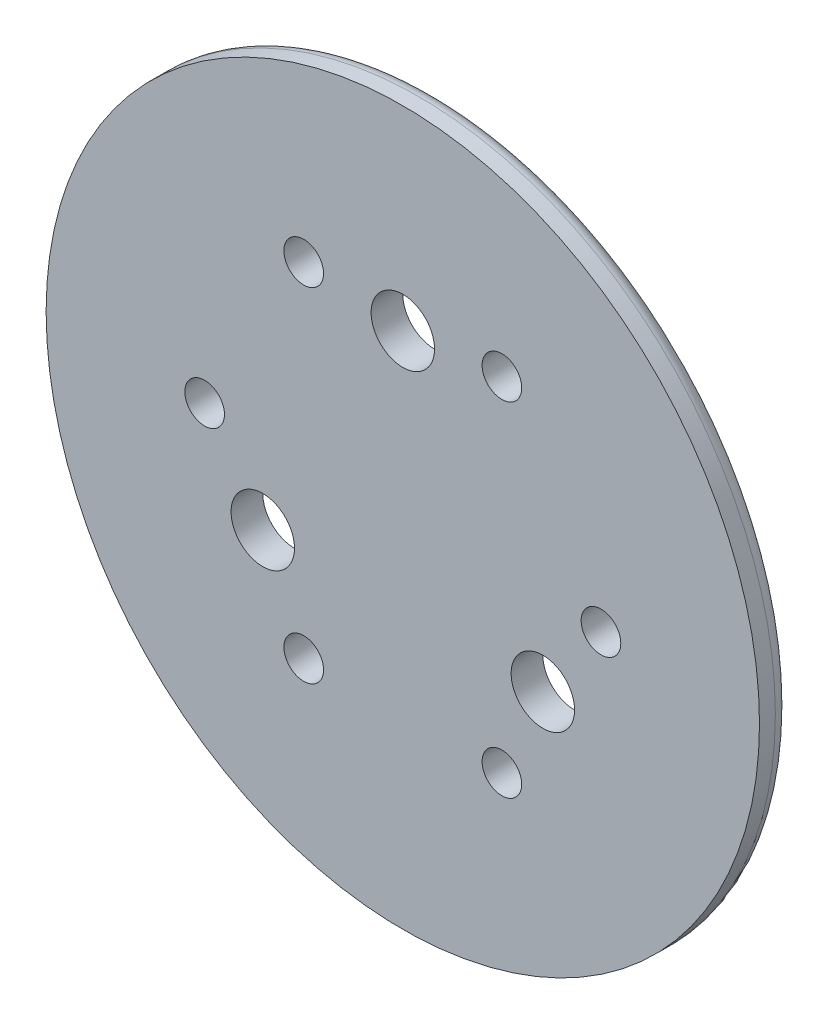
ISO-10303-21;
HEADER;
FILE_DESCRIPTION(('STEP AP214'),'2;1');
FILE_NAME('part.step','',(''),(''),'','','');
FILE_SCHEMA(('AUTOMOTIVE_DESIGN { 1 0 10303 214 1 1 1 1 }'));
ENDSEC;
DATA;
#1=APPLICATION_CONTEXT('core data for automotive mechanical design processes');
#2=APPLICATION_PROTOCOL_DEFINITION('international standard','automotive_design',2000,#1);
#3=PRODUCT_CONTEXT('',#1,'mechanical');
#4=PRODUCT('Part','Part','',(#3));
#5=PRODUCT_RELATED_PRODUCT_CATEGORY('part','',(#4));
#6=PRODUCT_DEFINITION_FORMATION('','',#4);
#7=PRODUCT_DEFINITION_CONTEXT('part definition',#1,'design');
#8=PRODUCT_DEFINITION('design','',#6,#7);
#9=PRODUCT_DEFINITION_SHAPE('','',#8);
#10=(LENGTH_UNIT() NAMED_UNIT(*) SI_UNIT(.MILLI.,.METRE.));
#11=(NAMED_UNIT(*) PLANE_ANGLE_UNIT() SI_UNIT($,.RADIAN.));
#12=(NAMED_UNIT(*) SI_UNIT($,.STERADIAN.) SOLID_ANGLE_UNIT());
#13=UNCERTAINTY_MEASURE_WITH_UNIT(LENGTH_MEASURE(1.E-05),#10,'distance_accuracy_value','');
#14=(GEOMETRIC_REPRESENTATION_CONTEXT(3) GLOBAL_UNCERTAINTY_ASSIGNED_CONTEXT((#13)) GLOBAL_UNIT_ASSIGNED_CONTEXT((#10,
#11,#12)) REPRESENTATION_CONTEXT('',''));
#15=CARTESIAN_POINT('',(0.,0.,0.));
#16=DIRECTION('',(0.,0.,1.));
#17=DIRECTION('',(1.,0.,0.));
#18=AXIS2_PLACEMENT_3D('',#15,#16,#17);
#19=CARTESIAN_POINT('',(0.,0.,2.));
#20=DIRECTION('',(0.,0.,1.));
#21=DIRECTION('',(1.,0.,0.));
#22=AXIS2_PLACEMENT_3D('',#19,#20,#21);
#23=PLANE('',#22);
#24=CARTESIAN_POINT('',(-8.83345911860132,-5.09999999999992,2.));
#25=DIRECTION('',(0.,0.,1.));
#26=DIRECTION('',(1.,0.,0.));
#27=AXIS2_PLACEMENT_3D('',#24,#25,#26);
#28=CIRCLE('',#27,2.);
#29=CARTESIAN_POINT('',(-6.83345911860132,-5.09999999999992,2.));
#30=VERTEX_POINT('',#29);
#31=EDGE_CURVE('E94',#30,#30,#28,.T.);
#32=ORIENTED_EDGE('',*,*,#31,.F.);
#33=EDGE_LOOP('',(#32));
#34=FACE_BOUND('',#33,.T.);
#35=CARTESIAN_POINT('',(-6.2500000000001,-10.8253175473054,2.));
#36=DIRECTION('',(0.,0.,1.));
#37=DIRECTION('',(1.,0.,0.));
#38=AXIS2_PLACEMENT_3D('',#35,#36,#37);
#39=CIRCLE('',#38,1.25);
#40=CARTESIAN_POINT('',(-5.0000000000001,-10.8253175473054,2.));
#41=VERTEX_POINT('',#40);
#42=EDGE_CURVE('E82',#41,#41,#39,.T.);
#43=ORIENTED_EDGE('',*,*,#42,.F.);
#44=EDGE_LOOP('',(#43));
#45=FACE_BOUND('',#44,.T.);
#46=CARTESIAN_POINT('',(12.5,0.,2.));
#47=DIRECTION('',(0.,0.,1.));
#48=DIRECTION('',(1.,0.,0.));
#49=AXIS2_PLACEMENT_3D('',#46,#47,#48);
#50=CIRCLE('',#49,1.25);
#51=CARTESIAN_POINT('',(13.75,0.,2.));
#52=VERTEX_POINT('',#51);
#53=EDGE_CURVE('E70',#52,#52,#50,.T.);
#54=ORIENTED_EDGE('',*,*,#53,.F.);
#55=EDGE_LOOP('',(#54));
#56=FACE_BOUND('',#55,.T.);
#57=CARTESIAN_POINT('',(-6.25000000000002,10.8253175473055,2.));
#58=DIRECTION('',(0.,0.,1.));
#59=DIRECTION('',(1.,0.,0.));
#60=AXIS2_PLACEMENT_3D('',#57,#58,#59);
#61=CIRCLE('',#60,1.25);
#62=CARTESIAN_POINT('',(-5.00000000000002,10.8253175473055,2.));
#63=VERTEX_POINT('',#62);
#64=EDGE_CURVE('E58',#63,#63,#61,.T.);
#65=ORIENTED_EDGE('',*,*,#64,.F.);
#66=EDGE_LOOP('',(#65));
#67=FACE_BOUND('',#66,.T.);
#68=CARTESIAN_POINT('',(0.,0.,2.));
#69=DIRECTION('',(0.,0.,1.));
#70=DIRECTION('',(1.,0.,0.));
#71=AXIS2_PLACEMENT_3D('',#68,#69,#70);
#72=CIRCLE('',#71,22.5);
#73=CARTESIAN_POINT('',(22.5,0.,2.));
#74=VERTEX_POINT('',#73);
#75=EDGE_CURVE('E48',#74,#74,#72,.T.);
#76=ORIENTED_EDGE('',*,*,#75,.T.);
#77=EDGE_LOOP('',(#76));
#78=FACE_BOUND('',#77,.T.);
#79=CARTESIAN_POINT('',(0.,10.2,2.));
#80=DIRECTION('',(0.,0.,1.));
#81=DIRECTION('',(1.,0.,0.));
#82=AXIS2_PLACEMENT_3D('',#79,#80,#81);
#83=CIRCLE('',#82,2.);
#84=CARTESIAN_POINT('',(2.,10.2,2.));
#85=VERTEX_POINT('',#84);
#86=EDGE_CURVE('E52',#85,#85,#83,.T.);
#87=ORIENTED_EDGE('',*,*,#86,.F.);
#88=EDGE_LOOP('',(#87));
#89=FACE_BOUND('',#88,.T.);
#90=CARTESIAN_POINT('',(6.25000000000002,10.8253175473055,2.));
#91=DIRECTION('',(0.,0.,1.));
#92=DIRECTION('',(1.,0.,0.));
#93=AXIS2_PLACEMENT_3D('',#90,#91,#92);
#94=CIRCLE('',#93,1.25);
#95=CARTESIAN_POINT('',(7.50000000000002,10.8253175473055,2.));
#96=VERTEX_POINT('',#95);
#97=EDGE_CURVE('E64',#96,#96,#94,.T.);
#98=ORIENTED_EDGE('',*,*,#97,.F.);
#99=EDGE_LOOP('',(#98));
#100=FACE_BOUND('',#99,.T.);
#101=CARTESIAN_POINT('',(6.24999999999993,-10.8253175473055,2.));
#102=DIRECTION('',(0.,0.,1.));
#103=DIRECTION('',(1.,0.,0.));
#104=AXIS2_PLACEMENT_3D('',#101,#102,#103);
#105=CIRCLE('',#104,1.25);
#106=CARTESIAN_POINT('',(7.49999999999993,-10.8253175473055,2.));
#107=VERTEX_POINT('',#106);
#108=EDGE_CURVE('E76',#107,#107,#105,.T.);
#109=ORIENTED_EDGE('',*,*,#108,.F.);
#110=EDGE_LOOP('',(#109));
#111=FACE_BOUND('',#110,.T.);
#112=CARTESIAN_POINT('',(-12.5,1.38083988687754E-13,2.));
#113=DIRECTION('',(0.,0.,1.));
#114=DIRECTION('',(1.,0.,0.));
#115=AXIS2_PLACEMENT_3D('',#112,#113,#114);
#116=CIRCLE('',#115,1.25);
#117=CARTESIAN_POINT('',(-11.25,1.38083988687754E-13,2.));
#118=VERTEX_POINT('',#117);
#119=EDGE_CURVE('E88',#118,#118,#116,.T.);
#120=ORIENTED_EDGE('',*,*,#119,.F.);
#121=EDGE_LOOP('',(#120));
#122=FACE_BOUND('',#121,.T.);
#123=CARTESIAN_POINT('',(8.83345911860125,-5.10000000000004,2.));
#124=DIRECTION('',(0.,0.,1.));
#125=DIRECTION('',(1.,0.,0.));
#126=AXIS2_PLACEMENT_3D('',#123,#124,#125);
#127=CIRCLE('',#126,2.);
#128=CARTESIAN_POINT('',(10.8334591186013,-5.10000000000004,2.));
#129=VERTEX_POINT('',#128);
#130=EDGE_CURVE('E100',#129,#129,#127,.T.);
#131=ORIENTED_EDGE('',*,*,#130,.F.);
#132=EDGE_LOOP('',(#131));
#133=FACE_BOUND('',#132,.T.);
#134=ADVANCED_FACE('F37',(#34,#45,#56,#67,#78,#89,#100,#111,#122,#133),#23,.T.);
#135=CARTESIAN_POINT('',(0.,0.,0.));
#136=DIRECTION('',(0.,0.,1.));
#137=DIRECTION('',(1.,0.,0.));
#138=AXIS2_PLACEMENT_3D('',#135,#136,#137);
#139=PLANE('',#138);
#140=CARTESIAN_POINT('',(0.,0.,0.));
#141=DIRECTION('',(0.,0.,1.));
#142=DIRECTION('',(1.,0.,0.));
#143=AXIS2_PLACEMENT_3D('',#140,#141,#142);
#144=CIRCLE('',#143,21.5);
#145=CARTESIAN_POINT('',(21.5,0.,0.));
#146=VERTEX_POINT('',#145);
#147=EDGE_CURVE('E10',#146,#146,#144,.F.);
#148=ORIENTED_EDGE('',*,*,#147,.T.);
#149=EDGE_LOOP('',(#148));
#150=FACE_BOUND('',#149,.T.);
#151=CARTESIAN_POINT('',(0.,10.2,0.));
#152=DIRECTION('',(0.,0.,1.));
#153=DIRECTION('',(1.,0.,0.));
#154=AXIS2_PLACEMENT_3D('',#151,#152,#153);
#155=CIRCLE('',#154,2.);
#156=CARTESIAN_POINT('',(2.,10.2,0.));
#157=VERTEX_POINT('',#156);
#158=EDGE_CURVE('E55',#157,#157,#155,.T.);
#159=ORIENTED_EDGE('',*,*,#158,.T.);
#160=EDGE_LOOP('',(#159));
#161=FACE_BOUND('',#160,.T.);
#162=CARTESIAN_POINT('',(-6.25000000000002,10.8253175473055,0.));
#163=DIRECTION('',(0.,0.,1.));
#164=DIRECTION('',(1.,0.,0.));
#165=AXIS2_PLACEMENT_3D('',#162,#163,#164);
#166=CIRCLE('',#165,1.25);
#167=CARTESIAN_POINT('',(-5.00000000000002,10.8253175473055,0.));
#168=VERTEX_POINT('',#167);
#169=EDGE_CURVE('E61',#168,#168,#166,.T.);
#170=ORIENTED_EDGE('',*,*,#169,.T.);
#171=EDGE_LOOP('',(#170));
#172=FACE_BOUND('',#171,.T.);
#173=CARTESIAN_POINT('',(6.25000000000002,10.8253175473055,0.));
#174=DIRECTION('',(0.,0.,1.));
#175=DIRECTION('',(1.,0.,0.));
#176=AXIS2_PLACEMENT_3D('',#173,#174,#175);
#177=CIRCLE('',#176,1.25);
#178=CARTESIAN_POINT('',(7.50000000000002,10.8253175473055,0.));
#179=VERTEX_POINT('',#178);
#180=EDGE_CURVE('E67',#179,#179,#177,.T.);
#181=ORIENTED_EDGE('',*,*,#180,.T.);
#182=EDGE_LOOP('',(#181));
#183=FACE_BOUND('',#182,.T.);
#184=CARTESIAN_POINT('',(12.5,0.,0.));
#185=DIRECTION('',(0.,0.,1.));
#186=DIRECTION('',(1.,0.,0.));
#187=AXIS2_PLACEMENT_3D('',#184,#185,#186);
#188=CIRCLE('',#187,1.25);
#189=CARTESIAN_POINT('',(13.75,0.,0.));
#190=VERTEX_POINT('',#189);
#191=EDGE_CURVE('E73',#190,#190,#188,.T.);
#192=ORIENTED_EDGE('',*,*,#191,.T.);
#193=EDGE_LOOP('',(#192));
#194=FACE_BOUND('',#193,.T.);
#195=CARTESIAN_POINT('',(6.24999999999993,-10.8253175473055,0.));
#196=DIRECTION('',(0.,0.,1.));
#197=DIRECTION('',(1.,0.,0.));
#198=AXIS2_PLACEMENT_3D('',#195,#196,#197);
#199=CIRCLE('',#198,1.25);
#200=CARTESIAN_POINT('',(7.49999999999993,-10.8253175473055,0.));
#201=VERTEX_POINT('',#200);
#202=EDGE_CURVE('E79',#201,#201,#199,.T.);
#203=ORIENTED_EDGE('',*,*,#202,.T.);
#204=EDGE_LOOP('',(#203));
#205=FACE_BOUND('',#204,.T.);
#206=CARTESIAN_POINT('',(-6.2500000000001,-10.8253175473054,0.));
#207=DIRECTION('',(0.,0.,1.));
#208=DIRECTION('',(1.,0.,0.));
#209=AXIS2_PLACEMENT_3D('',#206,#207,#208);
#210=CIRCLE('',#209,1.25);
#211=CARTESIAN_POINT('',(-5.0000000000001,-10.8253175473054,0.));
#212=VERTEX_POINT('',#211);
#213=EDGE_CURVE('E85',#212,#212,#210,.T.);
#214=ORIENTED_EDGE('',*,*,#213,.T.);
#215=EDGE_LOOP('',(#214));
#216=FACE_BOUND('',#215,.T.);
#217=CARTESIAN_POINT('',(-12.5,1.38083988687754E-13,0.));
#218=DIRECTION('',(0.,0.,1.));
#219=DIRECTION('',(1.,0.,0.));
#220=AXIS2_PLACEMENT_3D('',#217,#218,#219);
#221=CIRCLE('',#220,1.25);
#222=CARTESIAN_POINT('',(-11.25,1.38083988687754E-13,0.));
#223=VERTEX_POINT('',#222);
#224=EDGE_CURVE('E91',#223,#223,#221,.T.);
#225=ORIENTED_EDGE('',*,*,#224,.T.);
#226=EDGE_LOOP('',(#225));
#227=FACE_BOUND('',#226,.T.);
#228=CARTESIAN_POINT('',(-8.83345911860132,-5.09999999999992,0.));
#229=DIRECTION('',(0.,0.,1.));
#230=DIRECTION('',(1.,0.,0.));
#231=AXIS2_PLACEMENT_3D('',#228,#229,#230);
#232=CIRCLE('',#231,2.);
#233=CARTESIAN_POINT('',(-6.83345911860132,-5.09999999999992,0.));
#234=VERTEX_POINT('',#233);
#235=EDGE_CURVE('E97',#234,#234,#232,.T.);
#236=ORIENTED_EDGE('',*,*,#235,.T.);
#237=EDGE_LOOP('',(#236));
#238=FACE_BOUND('',#237,.T.);
#239=CARTESIAN_POINT('',(8.83345911860125,-5.10000000000004,0.));
#240=DIRECTION('',(0.,0.,1.));
#241=DIRECTION('',(1.,0.,0.));
#242=AXIS2_PLACEMENT_3D('',#239,#240,#241);
#243=CIRCLE('',#242,2.);
#244=CARTESIAN_POINT('',(10.8334591186013,-5.10000000000004,0.));
#245=VERTEX_POINT('',#244);
#246=EDGE_CURVE('E103',#245,#245,#243,.T.);
#247=ORIENTED_EDGE('',*,*,#246,.T.);
#248=EDGE_LOOP('',(#247));
#249=FACE_BOUND('',#248,.T.);
#250=ADVANCED_FACE('F113',(#150,#161,#172,#183,#194,#205,#216,#227,#238,#249),#139,.F.);
#251=CARTESIAN_POINT('',(0.,0.,2.));
#252=DIRECTION('',(0.,0.,-1.));
#253=DIRECTION('',(-1.,0.,0.));
#254=AXIS2_PLACEMENT_3D('',#251,#252,#253);
#255=CYLINDRICAL_SURFACE('',#254,22.5);
#256=CARTESIAN_POINT('',(0.,0.,1.));
#257=DIRECTION('',(0.,0.,1.));
#258=DIRECTION('',(1.,0.,0.));
#259=AXIS2_PLACEMENT_3D('',#256,#257,#258);
#260=CIRCLE('',#259,22.5);
#261=CARTESIAN_POINT('',(22.5,0.,1.));
#262=VERTEX_POINT('',#261);
#263=EDGE_CURVE('E44',#262,#262,#260,.T.);
#264=ORIENTED_EDGE('',*,*,#263,.T.);
#265=EDGE_LOOP('',(#264));
#266=FACE_BOUND('',#265,.T.);
#267=ORIENTED_EDGE('',*,*,#75,.F.);
#268=EDGE_LOOP('',(#267));
#269=FACE_BOUND('',#268,.T.);
#270=ADVANCED_FACE('F119',(#266,#269),#255,.T.);
#271=CARTESIAN_POINT('',(0.,10.2,2.));
#272=DIRECTION('',(0.,0.,-1.));
#273=DIRECTION('',(-1.,0.,0.));
#274=AXIS2_PLACEMENT_3D('',#271,#272,#273);
#275=CYLINDRICAL_SURFACE('',#274,2.);
#276=ORIENTED_EDGE('',*,*,#86,.T.);
#277=EDGE_LOOP('',(#276));
#278=FACE_BOUND('',#277,.T.);
#279=ORIENTED_EDGE('',*,*,#158,.F.);
#280=EDGE_LOOP('',(#279));
#281=FACE_BOUND('',#280,.T.);
#282=ADVANCED_FACE('F124',(#278,#281),#275,.F.);
#283=CARTESIAN_POINT('',(-6.25000000000002,10.8253175473055,2.));
#284=DIRECTION('',(0.,0.,-1.));
#285=DIRECTION('',(-1.,0.,0.));
#286=AXIS2_PLACEMENT_3D('',#283,#284,#285);
#287=CYLINDRICAL_SURFACE('',#286,1.25);
#288=ORIENTED_EDGE('',*,*,#64,.T.);
#289=EDGE_LOOP('',(#288));
#290=FACE_BOUND('',#289,.T.);
#291=ORIENTED_EDGE('',*,*,#169,.F.);
#292=EDGE_LOOP('',(#291));
#293=FACE_BOUND('',#292,.T.);
#294=ADVANCED_FACE('F130',(#290,#293),#287,.F.);
#295=CARTESIAN_POINT('',(6.25000000000002,10.8253175473055,2.));
#296=DIRECTION('',(0.,0.,-1.));
#297=DIRECTION('',(-1.,0.,0.));
#298=AXIS2_PLACEMENT_3D('',#295,#296,#297);
#299=CYLINDRICAL_SURFACE('',#298,1.25);
#300=ORIENTED_EDGE('',*,*,#97,.T.);
#301=EDGE_LOOP('',(#300));
#302=FACE_BOUND('',#301,.T.);
#303=ORIENTED_EDGE('',*,*,#180,.F.);
#304=EDGE_LOOP('',(#303));
#305=FACE_BOUND('',#304,.T.);
#306=ADVANCED_FACE('F176',(#302,#305),#299,.F.);
#307=CARTESIAN_POINT('',(12.5,0.,2.));
#308=DIRECTION('',(0.,0.,-1.));
#309=DIRECTION('',(-1.,0.,0.));
#310=AXIS2_PLACEMENT_3D('',#307,#308,#309);
#311=CYLINDRICAL_SURFACE('',#310,1.25);
#312=ORIENTED_EDGE('',*,*,#53,.T.);
#313=EDGE_LOOP('',(#312));
#314=FACE_BOUND('',#313,.T.);
#315=ORIENTED_EDGE('',*,*,#191,.F.);
#316=EDGE_LOOP('',(#315));
#317=FACE_BOUND('',#316,.T.);
#318=ADVANCED_FACE('F172',(#314,#317),#311,.F.);
#319=CARTESIAN_POINT('',(6.24999999999993,-10.8253175473055,2.));
#320=DIRECTION('',(0.,0.,-1.));
#321=DIRECTION('',(-1.,0.,0.));
#322=AXIS2_PLACEMENT_3D('',#319,#320,#321);
#323=CYLINDRICAL_SURFACE('',#322,1.25);
#324=ORIENTED_EDGE('',*,*,#108,.T.);
#325=EDGE_LOOP('',(#324));
#326=FACE_BOUND('',#325,.T.);
#327=ORIENTED_EDGE('',*,*,#202,.F.);
#328=EDGE_LOOP('',(#327));
#329=FACE_BOUND('',#328,.T.);
#330=ADVANCED_FACE('F168',(#326,#329),#323,.F.);
#331=CARTESIAN_POINT('',(-6.2500000000001,-10.8253175473054,2.));
#332=DIRECTION('',(0.,0.,-1.));
#333=DIRECTION('',(-1.,0.,0.));
#334=AXIS2_PLACEMENT_3D('',#331,#332,#333);
#335=CYLINDRICAL_SURFACE('',#334,1.25);
#336=ORIENTED_EDGE('',*,*,#42,.T.);
#337=EDGE_LOOP('',(#336));
#338=FACE_BOUND('',#337,.T.);
#339=ORIENTED_EDGE('',*,*,#213,.F.);
#340=EDGE_LOOP('',(#339));
#341=FACE_BOUND('',#340,.T.);
#342=ADVANCED_FACE('F148',(#338,#341),#335,.F.);
#343=CARTESIAN_POINT('',(-12.5,1.38083988687754E-13,2.));
#344=DIRECTION('',(0.,0.,-1.));
#345=DIRECTION('',(-1.,0.,0.));
#346=AXIS2_PLACEMENT_3D('',#343,#344,#345);
#347=CYLINDRICAL_SURFACE('',#346,1.25);
#348=ORIENTED_EDGE('',*,*,#119,.T.);
#349=EDGE_LOOP('',(#348));
#350=FACE_BOUND('',#349,.T.);
#351=ORIENTED_EDGE('',*,*,#224,.F.);
#352=EDGE_LOOP('',(#351));
#353=FACE_BOUND('',#352,.T.);
#354=ADVANCED_FACE('F144',(#350,#353),#347,.F.);
#355=CARTESIAN_POINT('',(-8.83345911860132,-5.09999999999992,2.));
#356=DIRECTION('',(0.,0.,-1.));
#357=DIRECTION('',(-1.,0.,0.));
#358=AXIS2_PLACEMENT_3D('',#355,#356,#357);
#359=CYLINDRICAL_SURFACE('',#358,2.);
#360=ORIENTED_EDGE('',*,*,#31,.T.);
#361=EDGE_LOOP('',(#360));
#362=FACE_BOUND('',#361,.T.);
#363=ORIENTED_EDGE('',*,*,#235,.F.);
#364=EDGE_LOOP('',(#363));
#365=FACE_BOUND('',#364,.T.);
#366=ADVANCED_FACE('F147',(#362,#365),#359,.F.);
#367=CARTESIAN_POINT('',(8.83345911860125,-5.10000000000004,2.));
#368=DIRECTION('',(0.,0.,-1.));
#369=DIRECTION('',(-1.,0.,0.));
#370=AXIS2_PLACEMENT_3D('',#367,#368,#369);
#371=CYLINDRICAL_SURFACE('',#370,2.);
#372=ORIENTED_EDGE('',*,*,#130,.T.);
#373=EDGE_LOOP('',(#372));
#374=FACE_BOUND('',#373,.T.);
#375=ORIENTED_EDGE('',*,*,#246,.F.);
#376=EDGE_LOOP('',(#375));
#377=FACE_BOUND('',#376,.T.);
#378=ADVANCED_FACE('F109',(#374,#377),#371,.F.);
#379=CARTESIAN_POINT('',(0.,0.,1.));
#380=DIRECTION('',(0.,0.,1.));
#381=DIRECTION('',(1.,0.,0.));
#382=AXIS2_PLACEMENT_3D('',#379,#380,#381);
#383=TOROIDAL_SURFACE('',#382,21.5,1.);
#384=ORIENTED_EDGE('',*,*,#147,.F.);
#385=EDGE_LOOP('',(#384));
#386=FACE_BOUND('',#385,.T.);
#387=ORIENTED_EDGE('',*,*,#263,.F.);
#388=EDGE_LOOP('',(#387));
#389=FACE_BOUND('',#388,.T.);
#390=ADVANCED_FACE('F39',(#386,#389),#383,.T.);
#391=CLOSED_SHELL('',(#134,#250,#270,#282,#294,#306,#318,#330,#342,#354,#366,#378,#390));
#392=MANIFOLD_SOLID_BREP('B2',#391);
#393=ADVANCED_BREP_SHAPE_REPRESENTATION('',(#18,#392),#14);
#394=SHAPE_DEFINITION_REPRESENTATION(#9,#393);
ENDSEC;
END-ISO-10303-21;
